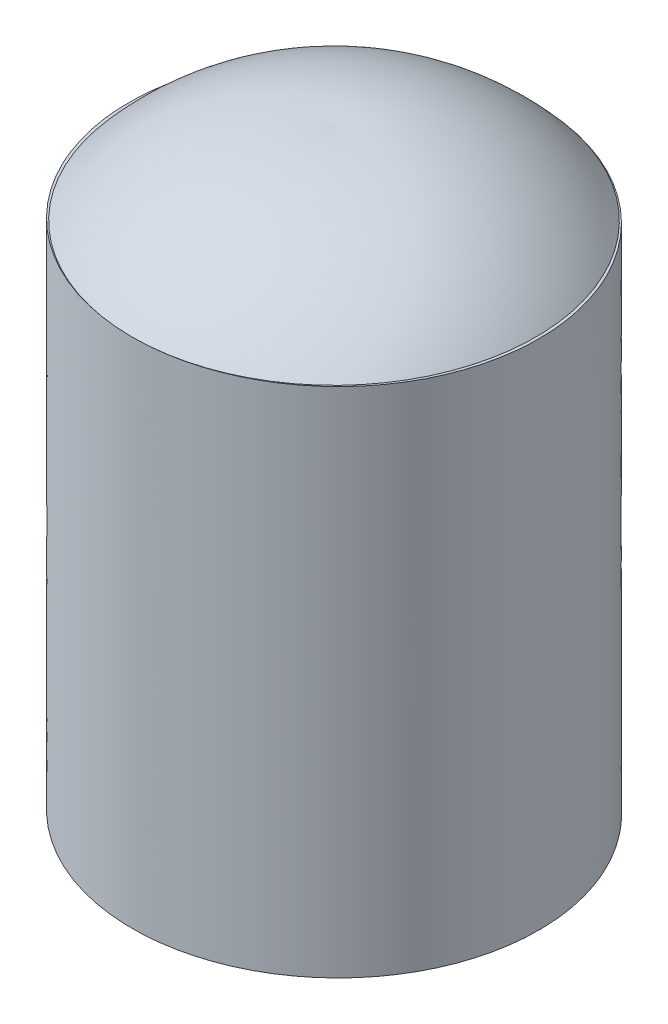
ISO-10303-21;
HEADER;
FILE_DESCRIPTION(('STEP AP214'),'2;1');
FILE_NAME('part.step','',(''),(''),'','','');
FILE_SCHEMA(('AUTOMOTIVE_DESIGN { 1 0 10303 214 1 1 1 1 }'));
ENDSEC;
DATA;
#1=APPLICATION_CONTEXT('core data for automotive mechanical design processes');
#2=APPLICATION_PROTOCOL_DEFINITION('international standard','automotive_design',2000,#1);
#3=PRODUCT_CONTEXT('',#1,'mechanical');
#4=PRODUCT('Part','Part','',(#3));
#5=PRODUCT_RELATED_PRODUCT_CATEGORY('part','',(#4));
#6=PRODUCT_DEFINITION_FORMATION('','',#4);
#7=PRODUCT_DEFINITION_CONTEXT('part definition',#1,'design');
#8=PRODUCT_DEFINITION('design','',#6,#7);
#9=PRODUCT_DEFINITION_SHAPE('','',#8);
#10=(LENGTH_UNIT() NAMED_UNIT(*) SI_UNIT(.MILLI.,.METRE.));
#11=(NAMED_UNIT(*) PLANE_ANGLE_UNIT() SI_UNIT($,.RADIAN.));
#12=(NAMED_UNIT(*) SI_UNIT($,.STERADIAN.) SOLID_ANGLE_UNIT());
#13=UNCERTAINTY_MEASURE_WITH_UNIT(LENGTH_MEASURE(1.E-05),#10,'distance_accuracy_value','');
#14=(GEOMETRIC_REPRESENTATION_CONTEXT(3) GLOBAL_UNCERTAINTY_ASSIGNED_CONTEXT((#13)) GLOBAL_UNIT_ASSIGNED_CONTEXT((#10,
#11,#12)) REPRESENTATION_CONTEXT('',''));
#15=CARTESIAN_POINT('',(0.,0.,0.));
#16=DIRECTION('',(0.,0.,1.));
#17=DIRECTION('',(1.,0.,0.));
#18=AXIS2_PLACEMENT_3D('',#15,#16,#17);
#19=CARTESIAN_POINT('',(0.,0.,0.));
#20=DIRECTION('',(0.,1.,0.));
#21=DIRECTION('',(0.,0.,1.));
#22=AXIS2_PLACEMENT_3D('',#19,#20,#21);
#23=PLANE('',#22);
#24=CARTESIAN_POINT('',(0.,0.,0.));
#25=DIRECTION('',(0.,1.,0.));
#26=DIRECTION('',(-1.,0.,0.));
#27=AXIS2_PLACEMENT_3D('',#24,#25,#26);
#28=ELLIPSE('',#27,9.68810170750096,9.54690818529063);
#29=CARTESIAN_POINT('',(-1.3889910226526E-13,0.,-9.54690818528945));
#30=VERTEX_POINT('',#29);
#31=CARTESIAN_POINT('',(-0.0144867611324878,0.,9.546897193963));
#32=VERTEX_POINT('',#31);
#33=EDGE_CURVE('E100',#30,#32,#28,.T.);
#34=ORIENTED_EDGE('',*,*,#33,.T.);
#35=CARTESIAN_POINT('',(0.,0.,0.));
#36=DIRECTION('',(0.,1.,0.));
#37=DIRECTION('',(0.,0.,1.));
#38=AXIS2_PLACEMENT_3D('',#35,#36,#37);
#39=CIRCLE('',#38,9.54690818528945);
#40=EDGE_CURVE('E71',#30,#32,#39,.T.);
#41=ORIENTED_EDGE('',*,*,#40,.F.);
#42=EDGE_LOOP('',(#34,#41));
#43=FACE_BOUND('',#42,.T.);
#44=ADVANCED_FACE('F48',(#43),#23,.T.);
#45=CARTESIAN_POINT('',(0.,-24.231,0.));
#46=DIRECTION('',(0.,1.,0.));
#47=DIRECTION('',(0.,0.,1.));
#48=AXIS2_PLACEMENT_3D('',#45,#46,#47);
#49=PLANE('',#48);
#50=CARTESIAN_POINT('',(0.,-24.231,0.));
#51=DIRECTION('',(0.,1.,0.));
#52=DIRECTION('',(-1.,0.,0.));
#53=AXIS2_PLACEMENT_3D('',#50,#51,#52);
#54=ELLIPSE('',#53,8.,7.72);
#55=CARTESIAN_POINT('',(-8.,-24.231,0.));
#56=VERTEX_POINT('',#55);
#57=EDGE_CURVE('E173',#56,#56,#54,.T.);
#58=ORIENTED_EDGE('',*,*,#57,.T.);
#59=EDGE_LOOP('',(#58));
#60=FACE_BOUND('',#59,.T.);
#61=CARTESIAN_POINT('',(0.,-24.231,0.));
#62=DIRECTION('',(0.,1.,0.));
#63=DIRECTION('',(-1.,0.,0.));
#64=AXIS2_PLACEMENT_3D('',#61,#62,#63);
#65=ELLIPSE('',#64,9.68810170750096,9.54690818529063);
#66=CARTESIAN_POINT('',(-9.68810170750096,-24.231,0.));
#67=VERTEX_POINT('',#66);
#68=EDGE_CURVE('E12',#67,#67,#65,.T.);
#69=ORIENTED_EDGE('',*,*,#68,.F.);
#70=EDGE_LOOP('',(#69));
#71=FACE_BOUND('',#70,.T.);
#72=ADVANCED_FACE('F50',(#60,#71),#49,.F.);
#73=CARTESIAN_POINT('',(0.,0.,9.54690818529063));
#74=VERTEX_POINT('',#73);
#75=CARTESIAN_POINT('',(0.0144867611346064,0.,-9.54689719396299));
#76=VERTEX_POINT('',#75);
#77=EDGE_CURVE('E98',#74,#76,#28,.T.);
#78=ORIENTED_EDGE('',*,*,#77,.T.);
#79=EDGE_CURVE('E84',#74,#76,#39,.T.);
#80=ORIENTED_EDGE('',*,*,#79,.F.);
#81=EDGE_LOOP('',(#78,#80));
#82=FACE_BOUND('',#81,.T.);
#83=ADVANCED_FACE('F106',(#82),#23,.T.);
#84=CARTESIAN_POINT('',(-9.6880997951464,0.,0.00599849892919696));
#85=CARTESIAN_POINT('',(-9.68098670699512,-24.231,0.365818879241735));
#86=CARTESIAN_POINT('',(-9.70027422200596,0.,-19.0878141026839));
#87=CARTESIAN_POINT('',(-10.4234449855986,-24.231,-18.7139748770817));
#88=CARTESIAN_POINT('',(9.67592536828683,0.,-19.0998111005423));
#89=CARTESIAN_POINT('',(8.93852842839169,-24.231,-19.4456126355652));
#90=CARTESIAN_POINT('',(9.6880997951464,0.,-0.00599849892919579));
#91=CARTESIAN_POINT('',(9.68098670699512,-24.231,-0.365818879241738));
#92=CARTESIAN_POINT('',(9.70027422200596,0.,19.0878141026839));
#93=CARTESIAN_POINT('',(10.4234449855986,-24.231,18.7139748770817));
#94=CARTESIAN_POINT('',(-9.67592536828683,0.,19.0998111005423));
#95=CARTESIAN_POINT('',(-8.93852842839168,-24.231,19.4456126355652));
#96=CARTESIAN_POINT('',(-9.6880997951464,0.,0.00599849892919696));
#97=CARTESIAN_POINT('',(-9.68098670699512,-24.231,0.365818879241735));
#98=(BOUNDED_SURFACE() B_SPLINE_SURFACE(3,1,((#84,#85),(#86,#87),(#88,#89),(#90,#91),(#92,#93),
(#94,#95),(#96,#97)),.UNSPECIFIED.,.T.,.F.,.F.) B_SPLINE_SURFACE_WITH_KNOTS((4,3,4),(2,2),(0.,
0.5,1.),(0.,1.),.UNSPECIFIED.) GEOMETRIC_REPRESENTATION_ITEM() RATIONAL_B_SPLINE_SURFACE(((1.,
1.),(0.333333333333333,0.333333333333334),(0.333333333333333,0.333333333333334),(1.,1.),
(0.333333333333333,0.333333333333333),(0.333333333333333,0.333333333333333),(1.,1.))) REPRESENTATION_ITEM('') SURFACE());
#99=EDGE_CURVE('E53',#32,#74,#28,.T.);
#100=EDGE_CURVE('E86',#76,#30,#39,.T.);
#101=ORIENTED_EDGE('',*,*,#99,.F.);
#102=ORIENTED_EDGE('',*,*,#33,.F.);
#103=ORIENTED_EDGE('',*,*,#100,.F.);
#104=ORIENTED_EDGE('',*,*,#77,.F.);
#105=EDGE_LOOP('',(#101,#102,#103,#104));
#106=FACE_BOUND('',#105,.T.);
#107=ORIENTED_EDGE('',*,*,#68,.T.);
#108=EDGE_LOOP('',(#107));
#109=FACE_BOUND('',#108,.T.);
#110=ADVANCED_FACE('F96',(#106,#109),#98,.T.);
#111=CARTESIAN_POINT('',(0.,-61.,0.));
#112=DIRECTION('',(0.,1.,0.));
#113=DIRECTION('',(-1.,0.,0.));
#114=AXIS2_PLACEMENT_3D('',#111,#112,#113);
#115=ELLIPSE('',#114,8.,7.72);
#116=DIRECTION('',(0.,1.,0.));
#117=VECTOR('',#116,1.);
#118=SURFACE_OF_LINEAR_EXTRUSION('',#115,#117);
#119=CARTESIAN_POINT('',(0.,0.,0.));
#120=DIRECTION('',(0.,1.,0.));
#121=DIRECTION('',(-1.,0.,0.));
#122=AXIS2_PLACEMENT_3D('',#119,#120,#121);
#123=ELLIPSE('',#122,8.,7.72);
#124=CARTESIAN_POINT('',(-8.,0.,0.));
#125=VERTEX_POINT('',#124);
#126=EDGE_CURVE('E91',#125,#125,#123,.F.);
#127=ORIENTED_EDGE('',*,*,#126,.F.);
#128=EDGE_LOOP('',(#127));
#129=FACE_BOUND('',#128,.T.);
#130=ORIENTED_EDGE('',*,*,#57,.F.);
#131=EDGE_LOOP('',(#130));
#132=FACE_BOUND('',#131,.T.);
#133=ADVANCED_FACE('F129',(#129,#132),#118,.F.);
#134=CARTESIAN_POINT('',(0.,0.,-9.54690818528945));
#135=DIRECTION('',(0.,1.,0.));
#136=DIRECTION('',(0.,0.,1.));
#137=AXIS2_PLACEMENT_3D('',#134,#135,#136);
#138=PLANE('',#137);
#139=ORIENTED_EDGE('',*,*,#126,.T.);
#140=EDGE_LOOP('',(#139));
#141=FACE_BOUND('',#140,.T.);
#142=ADVANCED_FACE('F82',(#141),#138,.F.);
#143=CARTESIAN_POINT('',(0.,-7.5962555847073,0.807986762639476));
#144=DIRECTION('',(-1.,0.,0.));
#145=DIRECTION('',(0.,0.,1.));
#146=AXIS2_PLACEMENT_3D('',#143,#144,#145);
#147=CIRCLE('',#146,11.5789397847751);
#148=TRIMMED_CURVE('',#147,(PARAMETER_VALUE(-1.64063380301789)),
(PARAMETER_VALUE(1.64063380301789)),.T.,.PARAMETER.);
#149=CARTESIAN_POINT('',(0.,-7.5962555847073,0.));
#150=DIRECTION('',(0.,1.,0.));
#151=AXIS1_PLACEMENT('',#149,#150);
#152=SURFACE_OF_REVOLUTION('',#148,#151);
#153=CARTESIAN_POINT('',(0.,3.9544588490776,0.));
#154=VERTEX_POINT('',#153);
#155=VERTEX_LOOP('',#154);
#156=FACE_BOUND('',#155,.T.);
#157=ORIENTED_EDGE('',*,*,#79,.T.);
#158=ORIENTED_EDGE('',*,*,#100,.T.);
#159=ORIENTED_EDGE('',*,*,#40,.T.);
#160=ORIENTED_EDGE('',*,*,#99,.T.);
#161=EDGE_LOOP('',(#157,#158,#159,#160));
#162=FACE_BOUND('',#161,.T.);
#163=ADVANCED_FACE('F80',(#156,#162),#152,.T.);
#164=CLOSED_SHELL('',(#44,#72,#83,#110,#133,#142,#163));
#165=MANIFOLD_SOLID_BREP('B2',#164);
#166=ADVANCED_BREP_SHAPE_REPRESENTATION('',(#18,#165),#14);
#167=SHAPE_DEFINITION_REPRESENTATION(#9,#166);
ENDSEC;
END-ISO-10303-21;
